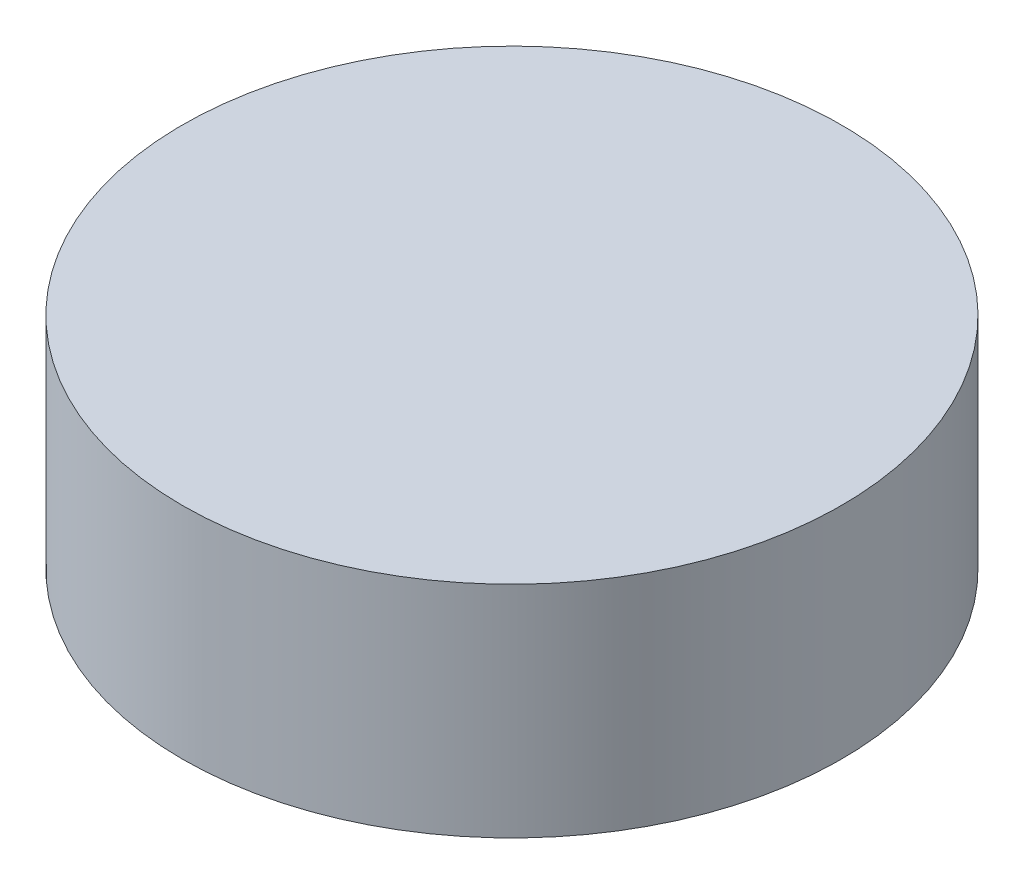
ISO-10303-21;
HEADER;
FILE_DESCRIPTION(('STEP AP214'),'2;1');
FILE_NAME('part.step','',(''),(''),'','','');
FILE_SCHEMA(('AUTOMOTIVE_DESIGN { 1 0 10303 214 1 1 1 1 }'));
ENDSEC;
DATA;
#1=APPLICATION_CONTEXT('core data for automotive mechanical design processes');
#2=APPLICATION_PROTOCOL_DEFINITION('international standard','automotive_design',2000,#1);
#3=PRODUCT_CONTEXT('',#1,'mechanical');
#4=PRODUCT('Part','Part','',(#3));
#5=PRODUCT_RELATED_PRODUCT_CATEGORY('part','',(#4));
#6=PRODUCT_DEFINITION_FORMATION('','',#4);
#7=PRODUCT_DEFINITION_CONTEXT('part definition',#1,'design');
#8=PRODUCT_DEFINITION('design','',#6,#7);
#9=PRODUCT_DEFINITION_SHAPE('','',#8);
#10=(LENGTH_UNIT() NAMED_UNIT(*) SI_UNIT(.MILLI.,.METRE.));
#11=(NAMED_UNIT(*) PLANE_ANGLE_UNIT() SI_UNIT($,.RADIAN.));
#12=(NAMED_UNIT(*) SI_UNIT($,.STERADIAN.) SOLID_ANGLE_UNIT());
#13=UNCERTAINTY_MEASURE_WITH_UNIT(LENGTH_MEASURE(1.E-05),#10,'distance_accuracy_value','');
#14=(GEOMETRIC_REPRESENTATION_CONTEXT(3) GLOBAL_UNCERTAINTY_ASSIGNED_CONTEXT((#13)) GLOBAL_UNIT_ASSIGNED_CONTEXT((#10,
#11,#12)) REPRESENTATION_CONTEXT('',''));
#15=CARTESIAN_POINT('',(0.,0.,0.));
#16=DIRECTION('',(0.,0.,1.));
#17=DIRECTION('',(1.,0.,0.));
#18=AXIS2_PLACEMENT_3D('',#15,#16,#17);
#19=CARTESIAN_POINT('',(0.,2.,0.));
#20=DIRECTION('',(0.,-1.,0.));
#21=DIRECTION('',(0.,0.,-1.));
#22=AXIS2_PLACEMENT_3D('',#19,#20,#21);
#23=CYLINDRICAL_SURFACE('',#22,3.);
#24=CARTESIAN_POINT('',(0.,2.,0.));
#25=DIRECTION('',(0.,1.,0.));
#26=DIRECTION('',(0.,0.,1.));
#27=AXIS2_PLACEMENT_3D('',#24,#25,#26);
#28=CIRCLE('',#27,3.);
#29=CARTESIAN_POINT('',(0.,2.,3.));
#30=VERTEX_POINT('',#29);
#31=EDGE_CURVE('E10',#30,#30,#28,.T.);
#32=ORIENTED_EDGE('',*,*,#31,.F.);
#33=EDGE_LOOP('',(#32));
#34=FACE_BOUND('',#33,.T.);
#35=CARTESIAN_POINT('',(0.,0.,0.));
#36=DIRECTION('',(0.,1.,0.));
#37=DIRECTION('',(0.,0.,1.));
#38=AXIS2_PLACEMENT_3D('',#35,#36,#37);
#39=CIRCLE('',#38,3.);
#40=CARTESIAN_POINT('',(0.,0.,3.));
#41=VERTEX_POINT('',#40);
#42=EDGE_CURVE('E40',#41,#41,#39,.T.);
#43=ORIENTED_EDGE('',*,*,#42,.T.);
#44=EDGE_LOOP('',(#43));
#45=FACE_BOUND('',#44,.T.);
#46=ADVANCED_FACE('F37',(#34,#45),#23,.T.);
#47=CARTESIAN_POINT('',(0.,2.,0.));
#48=DIRECTION('',(0.,1.,0.));
#49=DIRECTION('',(0.,0.,1.));
#50=AXIS2_PLACEMENT_3D('',#47,#48,#49);
#51=PLANE('',#50);
#52=ORIENTED_EDGE('',*,*,#31,.T.);
#53=EDGE_LOOP('',(#52));
#54=FACE_BOUND('',#53,.T.);
#55=ADVANCED_FACE('F54',(#54),#51,.T.);
#56=CARTESIAN_POINT('',(0.,0.,0.));
#57=DIRECTION('',(0.,1.,0.));
#58=DIRECTION('',(0.,0.,1.));
#59=AXIS2_PLACEMENT_3D('',#56,#57,#58);
#60=PLANE('',#59);
#61=ORIENTED_EDGE('',*,*,#42,.F.);
#62=EDGE_LOOP('',(#61));
#63=FACE_BOUND('',#62,.T.);
#64=ADVANCED_FACE('F52',(#63),#60,.F.);
#65=CLOSED_SHELL('',(#46,#55,#64));
#66=MANIFOLD_SOLID_BREP('B2',#65);
#67=ADVANCED_BREP_SHAPE_REPRESENTATION('',(#18,#66),#14);
#68=SHAPE_DEFINITION_REPRESENTATION(#9,#67);
ENDSEC;
END-ISO-10303-21;
